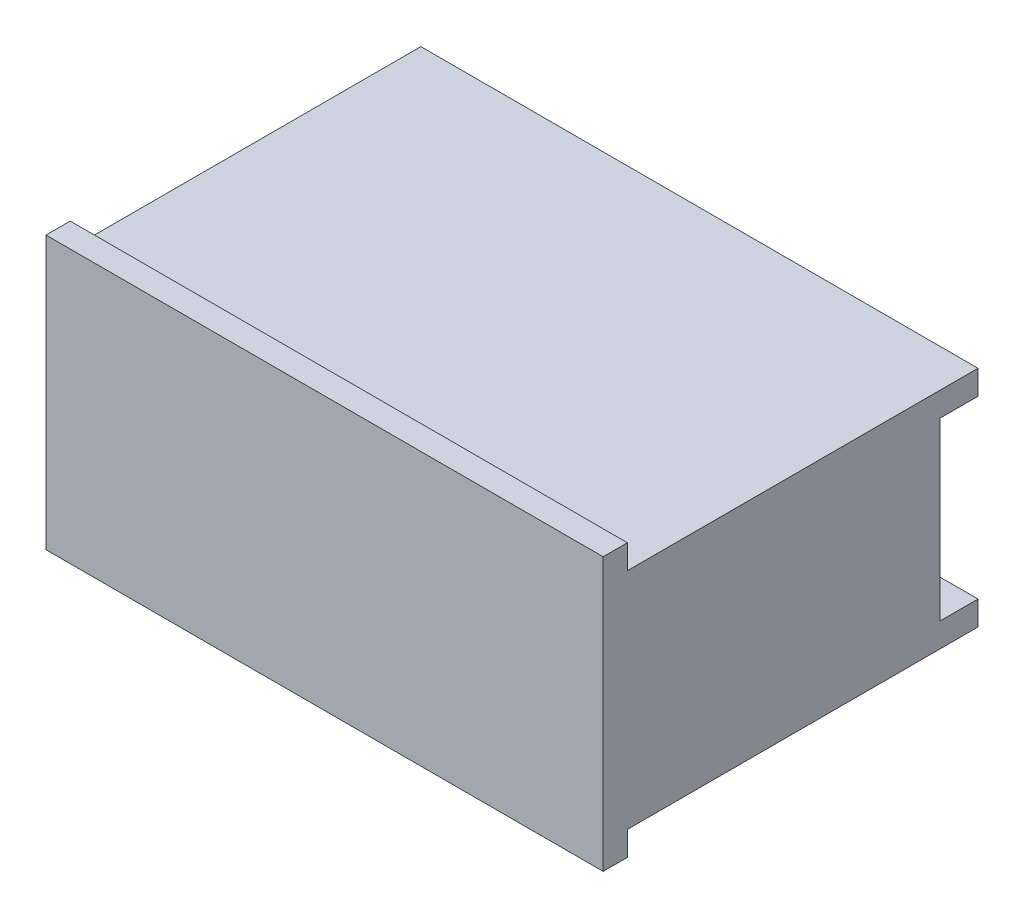
ISO-10303-21;
HEADER;
FILE_DESCRIPTION(('STEP AP214'),'2;1');
FILE_NAME('part.step','',(''),(''),'','','');
FILE_SCHEMA(('AUTOMOTIVE_DESIGN { 1 0 10303 214 1 1 1 1 }'));
ENDSEC;
DATA;
#1=APPLICATION_CONTEXT('core data for automotive mechanical design processes');
#2=APPLICATION_PROTOCOL_DEFINITION('international standard','automotive_design',2000,#1);
#3=PRODUCT_CONTEXT('',#1,'mechanical');
#4=PRODUCT('Part','Part','',(#3));
#5=PRODUCT_RELATED_PRODUCT_CATEGORY('part','',(#4));
#6=PRODUCT_DEFINITION_FORMATION('','',#4);
#7=PRODUCT_DEFINITION_CONTEXT('part definition',#1,'design');
#8=PRODUCT_DEFINITION('design','',#6,#7);
#9=PRODUCT_DEFINITION_SHAPE('','',#8);
#10=(LENGTH_UNIT() NAMED_UNIT(*) SI_UNIT(.MILLI.,.METRE.));
#11=(NAMED_UNIT(*) PLANE_ANGLE_UNIT() SI_UNIT($,.RADIAN.));
#12=(NAMED_UNIT(*) SI_UNIT($,.STERADIAN.) SOLID_ANGLE_UNIT());
#13=UNCERTAINTY_MEASURE_WITH_UNIT(LENGTH_MEASURE(1.E-05),#10,'distance_accuracy_value','');
#14=(GEOMETRIC_REPRESENTATION_CONTEXT(3) GLOBAL_UNCERTAINTY_ASSIGNED_CONTEXT((#13)) GLOBAL_UNIT_ASSIGNED_CONTEXT((#10,
#11,#12)) REPRESENTATION_CONTEXT('',''));
#15=CARTESIAN_POINT('',(0.,0.,0.));
#16=DIRECTION('',(0.,0.,1.));
#17=DIRECTION('',(1.,0.,0.));
#18=AXIS2_PLACEMENT_3D('',#15,#16,#17);
#19=CARTESIAN_POINT('',(0.,0.,-30.95));
#20=DIRECTION('',(0.,0.,1.));
#21=DIRECTION('',(1.,0.,0.));
#22=AXIS2_PLACEMENT_3D('',#19,#20,#21);
#23=PLANE('',#22);
#24=DIRECTION('',(1.,0.,0.));
#25=VECTOR('',#24,1.);
#26=CARTESIAN_POINT('',(23.,7.25,-30.95));
#27=LINE('',#26,#25);
#28=CARTESIAN_POINT('',(-23.,7.25,-30.95));
#29=VERTEX_POINT('',#28);
#30=CARTESIAN_POINT('',(23.,7.25,-30.95));
#31=VERTEX_POINT('',#30);
#32=EDGE_CURVE('E175',#29,#31,#27,.T.);
#33=ORIENTED_EDGE('',*,*,#32,.F.);
#34=DIRECTION('',(0.,-1.,0.));
#35=VECTOR('',#34,1.);
#36=CARTESIAN_POINT('',(-23.,9.25,-30.95));
#37=LINE('',#36,#35);
#38=CARTESIAN_POINT('',(-23.,9.25,-30.95));
#39=VERTEX_POINT('',#38);
#40=EDGE_CURVE('E206',#39,#29,#37,.T.);
#41=ORIENTED_EDGE('',*,*,#40,.F.);
#42=DIRECTION('',(-1.,0.,0.));
#43=VECTOR('',#42,1.);
#44=CARTESIAN_POINT('',(-23.,9.25,-30.95));
#45=LINE('',#44,#43);
#46=CARTESIAN_POINT('',(23.,9.25,-30.95));
#47=VERTEX_POINT('',#46);
#48=EDGE_CURVE('E203',#47,#39,#45,.T.);
#49=ORIENTED_EDGE('',*,*,#48,.F.);
#50=DIRECTION('',(0.,1.,0.));
#51=VECTOR('',#50,1.);
#52=CARTESIAN_POINT('',(23.,9.25,-30.95));
#53=LINE('',#52,#51);
#54=EDGE_CURVE('E205',#31,#47,#53,.T.);
#55=ORIENTED_EDGE('',*,*,#54,.F.);
#56=EDGE_LOOP('',(#33,#41,#49,#55));
#57=FACE_BOUND('',#56,.T.);
#58=ADVANCED_FACE('F39',(#57),#23,.F.);
#59=DIRECTION('',(-1.,0.,0.));
#60=VECTOR('',#59,1.);
#61=CARTESIAN_POINT('',(23.,-7.25,-30.95));
#62=LINE('',#61,#60);
#63=CARTESIAN_POINT('',(23.,-7.25,-30.95));
#64=VERTEX_POINT('',#63);
#65=CARTESIAN_POINT('',(-23.,-7.25,-30.95));
#66=VERTEX_POINT('',#65);
#67=EDGE_CURVE('E179',#64,#66,#62,.T.);
#68=ORIENTED_EDGE('',*,*,#67,.F.);
#69=CARTESIAN_POINT('',(23.,-9.25,-30.95));
#70=VERTEX_POINT('',#69);
#71=EDGE_CURVE('E196',#70,#64,#53,.T.);
#72=ORIENTED_EDGE('',*,*,#71,.F.);
#73=DIRECTION('',(1.,0.,0.));
#74=VECTOR('',#73,1.);
#75=CARTESIAN_POINT('',(-23.,-9.25,-30.95));
#76=LINE('',#75,#74);
#77=CARTESIAN_POINT('',(-23.,-9.25,-30.95));
#78=VERTEX_POINT('',#77);
#79=EDGE_CURVE('E207',#78,#70,#76,.T.);
#80=ORIENTED_EDGE('',*,*,#79,.F.);
#81=EDGE_CURVE('E202',#66,#78,#37,.T.);
#82=ORIENTED_EDGE('',*,*,#81,.F.);
#83=EDGE_LOOP('',(#68,#72,#80,#82));
#84=FACE_BOUND('',#83,.T.);
#85=ADVANCED_FACE('F241',(#84),#23,.F.);
#86=CARTESIAN_POINT('',(23.,9.25,-30.95));
#87=DIRECTION('',(1.,0.,0.));
#88=DIRECTION('',(0.,0.,-1.));
#89=AXIS2_PLACEMENT_3D('',#86,#87,#88);
#90=PLANE('',#89);
#91=DIRECTION('',(0.,-1.,0.));
#92=VECTOR('',#91,1.);
#93=CARTESIAN_POINT('',(23.,7.25,-27.8));
#94=LINE('',#93,#92);
#95=CARTESIAN_POINT('',(23.,7.25,-27.8));
#96=VERTEX_POINT('',#95);
#97=CARTESIAN_POINT('',(23.,-7.25,-27.8));
#98=VERTEX_POINT('',#97);
#99=EDGE_CURVE('E182',#96,#98,#94,.T.);
#100=ORIENTED_EDGE('',*,*,#99,.F.);
#101=DIRECTION('',(0.,0.,-1.));
#102=VECTOR('',#101,1.);
#103=CARTESIAN_POINT('',(23.,7.25,-27.8));
#104=LINE('',#103,#102);
#105=EDGE_CURVE('E193',#96,#31,#104,.T.);
#106=ORIENTED_EDGE('',*,*,#105,.T.);
#107=ORIENTED_EDGE('',*,*,#54,.T.);
#108=DIRECTION('',(0.,0.,1.));
#109=VECTOR('',#108,1.);
#110=CARTESIAN_POINT('',(23.,9.25,-30.95));
#111=LINE('',#110,#109);
#112=CARTESIAN_POINT('',(23.,9.25,-2.));
#113=VERTEX_POINT('',#112);
#114=EDGE_CURVE('E43',#47,#113,#111,.T.);
#115=ORIENTED_EDGE('',*,*,#114,.T.);
#116=DIRECTION('',(0.,-1.,0.));
#117=VECTOR('',#116,1.);
#118=CARTESIAN_POINT('',(23.,11.25,-2.));
#119=LINE('',#118,#117);
#120=CARTESIAN_POINT('',(23.,11.25,-2.));
#121=VERTEX_POINT('',#120);
#122=EDGE_CURVE('E132',#121,#113,#119,.T.);
#123=ORIENTED_EDGE('',*,*,#122,.F.);
#124=DIRECTION('',(0.,0.,-1.));
#125=VECTOR('',#124,1.);
#126=CARTESIAN_POINT('',(23.,11.25,-2.));
#127=LINE('',#126,#125);
#128=CARTESIAN_POINT('',(23.,11.25,0.));
#129=VERTEX_POINT('',#128);
#130=EDGE_CURVE('E142',#129,#121,#127,.T.);
#131=ORIENTED_EDGE('',*,*,#130,.F.);
#132=DIRECTION('',(0.,1.,0.));
#133=VECTOR('',#132,1.);
#134=CARTESIAN_POINT('',(23.,9.25,0.));
#135=LINE('',#134,#133);
#136=CARTESIAN_POINT('',(23.,-11.25,0.));
#137=VERTEX_POINT('',#136);
#138=EDGE_CURVE('E191',#137,#129,#135,.T.);
#139=ORIENTED_EDGE('',*,*,#138,.F.);
#140=DIRECTION('',(0.,0.,1.));
#141=VECTOR('',#140,1.);
#142=CARTESIAN_POINT('',(23.,-11.25,0.));
#143=LINE('',#142,#141);
#144=CARTESIAN_POINT('',(23.,-11.25,-2.));
#145=VERTEX_POINT('',#144);
#146=EDGE_CURVE('E153',#145,#137,#143,.T.);
#147=ORIENTED_EDGE('',*,*,#146,.F.);
#148=DIRECTION('',(0.,1.,0.));
#149=VECTOR('',#148,1.);
#150=CARTESIAN_POINT('',(23.,-11.25,-2.));
#151=LINE('',#150,#149);
#152=CARTESIAN_POINT('',(23.,-9.25,-2.));
#153=VERTEX_POINT('',#152);
#154=EDGE_CURVE('E167',#145,#153,#151,.T.);
#155=ORIENTED_EDGE('',*,*,#154,.T.);
#156=DIRECTION('',(0.,0.,1.));
#157=VECTOR('',#156,1.);
#158=CARTESIAN_POINT('',(23.,-9.25,-30.95));
#159=LINE('',#158,#157);
#160=EDGE_CURVE('E11',#70,#153,#159,.T.);
#161=ORIENTED_EDGE('',*,*,#160,.F.);
#162=ORIENTED_EDGE('',*,*,#71,.T.);
#163=DIRECTION('',(0.,0.,-1.));
#164=VECTOR('',#163,1.);
#165=CARTESIAN_POINT('',(23.,-7.25,-27.8));
#166=LINE('',#165,#164);
#167=EDGE_CURVE('E192',#98,#64,#166,.T.);
#168=ORIENTED_EDGE('',*,*,#167,.F.);
#169=EDGE_LOOP('',(#100,#106,#107,#115,#123,#131,#139,#147,#155,#161,#162,#168));
#170=FACE_BOUND('',#169,.T.);
#171=ADVANCED_FACE('F41',(#170),#90,.T.);
#172=CARTESIAN_POINT('',(-23.,9.25,-30.95));
#173=DIRECTION('',(-1.,0.,0.));
#174=DIRECTION('',(0.,0.,1.));
#175=AXIS2_PLACEMENT_3D('',#172,#173,#174);
#176=PLANE('',#175);
#177=DIRECTION('',(0.,1.,0.));
#178=VECTOR('',#177,1.);
#179=CARTESIAN_POINT('',(-23.,7.25,-27.8));
#180=LINE('',#179,#178);
#181=CARTESIAN_POINT('',(-23.,-7.25,-27.8));
#182=VERTEX_POINT('',#181);
#183=CARTESIAN_POINT('',(-23.,7.25,-27.8));
#184=VERTEX_POINT('',#183);
#185=EDGE_CURVE('E173',#182,#184,#180,.T.);
#186=ORIENTED_EDGE('',*,*,#185,.F.);
#187=DIRECTION('',(0.,0.,-1.));
#188=VECTOR('',#187,1.);
#189=CARTESIAN_POINT('',(-23.,-7.25,-27.8));
#190=LINE('',#189,#188);
#191=EDGE_CURVE('E190',#182,#66,#190,.T.);
#192=ORIENTED_EDGE('',*,*,#191,.T.);
#193=ORIENTED_EDGE('',*,*,#81,.T.);
#194=DIRECTION('',(0.,0.,1.));
#195=VECTOR('',#194,1.);
#196=CARTESIAN_POINT('',(-23.,-9.25,-30.95));
#197=LINE('',#196,#195);
#198=CARTESIAN_POINT('',(-23.,-9.25,-2.));
#199=VERTEX_POINT('',#198);
#200=EDGE_CURVE('E48',#78,#199,#197,.T.);
#201=ORIENTED_EDGE('',*,*,#200,.T.);
#202=DIRECTION('',(0.,1.,0.));
#203=VECTOR('',#202,1.);
#204=CARTESIAN_POINT('',(-23.,-11.25,-2.));
#205=LINE('',#204,#203);
#206=CARTESIAN_POINT('',(-23.,-11.25,-2.));
#207=VERTEX_POINT('',#206);
#208=EDGE_CURVE('E168',#207,#199,#205,.T.);
#209=ORIENTED_EDGE('',*,*,#208,.F.);
#210=DIRECTION('',(0.,0.,-1.));
#211=VECTOR('',#210,1.);
#212=CARTESIAN_POINT('',(-23.,-11.25,0.));
#213=LINE('',#212,#211);
#214=CARTESIAN_POINT('',(-23.,-11.25,0.));
#215=VERTEX_POINT('',#214);
#216=EDGE_CURVE('E162',#215,#207,#213,.T.);
#217=ORIENTED_EDGE('',*,*,#216,.F.);
#218=DIRECTION('',(0.,-1.,0.));
#219=VECTOR('',#218,1.);
#220=CARTESIAN_POINT('',(-23.,9.25,0.));
#221=LINE('',#220,#219);
#222=CARTESIAN_POINT('',(-23.,11.25,0.));
#223=VERTEX_POINT('',#222);
#224=EDGE_CURVE('E213',#223,#215,#221,.T.);
#225=ORIENTED_EDGE('',*,*,#224,.F.);
#226=DIRECTION('',(0.,0.,1.));
#227=VECTOR('',#226,1.);
#228=CARTESIAN_POINT('',(-23.,11.25,-2.));
#229=LINE('',#228,#227);
#230=CARTESIAN_POINT('',(-23.,11.25,-2.));
#231=VERTEX_POINT('',#230);
#232=EDGE_CURVE('E143',#231,#223,#229,.T.);
#233=ORIENTED_EDGE('',*,*,#232,.F.);
#234=DIRECTION('',(0.,-1.,0.));
#235=VECTOR('',#234,1.);
#236=CARTESIAN_POINT('',(-23.,11.25,-2.));
#237=LINE('',#236,#235);
#238=CARTESIAN_POINT('',(-23.,9.25,-2.));
#239=VERTEX_POINT('',#238);
#240=EDGE_CURVE('E137',#231,#239,#237,.T.);
#241=ORIENTED_EDGE('',*,*,#240,.T.);
#242=DIRECTION('',(0.,0.,1.));
#243=VECTOR('',#242,1.);
#244=CARTESIAN_POINT('',(-23.,9.25,-30.95));
#245=LINE('',#244,#243);
#246=EDGE_CURVE('E214',#39,#239,#245,.T.);
#247=ORIENTED_EDGE('',*,*,#246,.F.);
#248=ORIENTED_EDGE('',*,*,#40,.T.);
#249=DIRECTION('',(0.,0.,-1.));
#250=VECTOR('',#249,1.);
#251=CARTESIAN_POINT('',(-23.,7.25,-27.8));
#252=LINE('',#251,#250);
#253=EDGE_CURVE('E183',#184,#29,#252,.T.);
#254=ORIENTED_EDGE('',*,*,#253,.F.);
#255=EDGE_LOOP('',(#186,#192,#193,#201,#209,#217,#225,#233,#241,#247,#248,#254));
#256=FACE_BOUND('',#255,.T.);
#257=ADVANCED_FACE('F222',(#256),#176,.T.);
#258=CARTESIAN_POINT('',(-23.,-9.25,-30.95));
#259=DIRECTION('',(0.,-1.,0.));
#260=DIRECTION('',(0.,0.,-1.));
#261=AXIS2_PLACEMENT_3D('',#258,#259,#260);
#262=PLANE('',#261);
#263=DIRECTION('',(1.,0.,0.));
#264=VECTOR('',#263,1.);
#265=CARTESIAN_POINT('',(-23.,-9.25,-2.));
#266=LINE('',#265,#264);
#267=EDGE_CURVE('E65',#199,#153,#266,.T.);
#268=ORIENTED_EDGE('',*,*,#267,.F.);
#269=ORIENTED_EDGE('',*,*,#200,.F.);
#270=ORIENTED_EDGE('',*,*,#79,.T.);
#271=ORIENTED_EDGE('',*,*,#160,.T.);
#272=EDGE_LOOP('',(#268,#269,#270,#271));
#273=FACE_BOUND('',#272,.T.);
#274=ADVANCED_FACE('F236',(#273),#262,.T.);
#275=CARTESIAN_POINT('',(-23.,9.25,-30.95));
#276=DIRECTION('',(0.,1.,0.));
#277=DIRECTION('',(0.,0.,1.));
#278=AXIS2_PLACEMENT_3D('',#275,#276,#277);
#279=PLANE('',#278);
#280=DIRECTION('',(-1.,0.,0.));
#281=VECTOR('',#280,1.);
#282=CARTESIAN_POINT('',(-23.,9.25,-2.));
#283=LINE('',#282,#281);
#284=EDGE_CURVE('E57',#113,#239,#283,.T.);
#285=ORIENTED_EDGE('',*,*,#284,.F.);
#286=ORIENTED_EDGE('',*,*,#114,.F.);
#287=ORIENTED_EDGE('',*,*,#48,.T.);
#288=ORIENTED_EDGE('',*,*,#246,.T.);
#289=EDGE_LOOP('',(#285,#286,#287,#288));
#290=FACE_BOUND('',#289,.T.);
#291=ADVANCED_FACE('F216',(#290),#279,.T.);
#292=CARTESIAN_POINT('',(0.,0.,0.));
#293=DIRECTION('',(0.,0.,1.));
#294=DIRECTION('',(1.,0.,0.));
#295=AXIS2_PLACEMENT_3D('',#292,#293,#294);
#296=PLANE('',#295);
#297=ORIENTED_EDGE('',*,*,#138,.T.);
#298=DIRECTION('',(1.,0.,0.));
#299=VECTOR('',#298,1.);
#300=CARTESIAN_POINT('',(-23.,11.25,0.));
#301=LINE('',#300,#299);
#302=EDGE_CURVE('E146',#223,#129,#301,.T.);
#303=ORIENTED_EDGE('',*,*,#302,.F.);
#304=ORIENTED_EDGE('',*,*,#224,.T.);
#305=DIRECTION('',(-1.,0.,0.));
#306=VECTOR('',#305,1.);
#307=CARTESIAN_POINT('',(-23.,-11.25,0.));
#308=LINE('',#307,#306);
#309=EDGE_CURVE('E159',#137,#215,#308,.T.);
#310=ORIENTED_EDGE('',*,*,#309,.F.);
#311=EDGE_LOOP('',(#297,#303,#304,#310));
#312=FACE_BOUND('',#311,.T.);
#313=ADVANCED_FACE('F229',(#312),#296,.T.);
#314=CARTESIAN_POINT('',(23.,-7.25,-27.8));
#315=DIRECTION('',(0.,-1.,0.));
#316=DIRECTION('',(0.,0.,-1.));
#317=AXIS2_PLACEMENT_3D('',#314,#315,#316);
#318=PLANE('',#317);
#319=ORIENTED_EDGE('',*,*,#67,.T.);
#320=ORIENTED_EDGE('',*,*,#191,.F.);
#321=DIRECTION('',(-1.,0.,0.));
#322=VECTOR('',#321,1.);
#323=CARTESIAN_POINT('',(23.,-7.25,-27.8));
#324=LINE('',#323,#322);
#325=EDGE_CURVE('E181',#98,#182,#324,.T.);
#326=ORIENTED_EDGE('',*,*,#325,.F.);
#327=ORIENTED_EDGE('',*,*,#167,.T.);
#328=EDGE_LOOP('',(#319,#320,#326,#327));
#329=FACE_BOUND('',#328,.T.);
#330=ADVANCED_FACE('F246',(#329),#318,.F.);
#331=CARTESIAN_POINT('',(23.,7.25,-27.8));
#332=DIRECTION('',(0.,1.,0.));
#333=DIRECTION('',(0.,0.,1.));
#334=AXIS2_PLACEMENT_3D('',#331,#332,#333);
#335=PLANE('',#334);
#336=ORIENTED_EDGE('',*,*,#32,.T.);
#337=ORIENTED_EDGE('',*,*,#105,.F.);
#338=DIRECTION('',(1.,0.,0.));
#339=VECTOR('',#338,1.);
#340=CARTESIAN_POINT('',(23.,7.25,-27.8));
#341=LINE('',#340,#339);
#342=EDGE_CURVE('E177',#184,#96,#341,.T.);
#343=ORIENTED_EDGE('',*,*,#342,.F.);
#344=ORIENTED_EDGE('',*,*,#253,.T.);
#345=EDGE_LOOP('',(#336,#337,#343,#344));
#346=FACE_BOUND('',#345,.T.);
#347=ADVANCED_FACE('F252',(#346),#335,.F.);
#348=CARTESIAN_POINT('',(0.,0.,-27.8));
#349=DIRECTION('',(0.,0.,-1.));
#350=DIRECTION('',(-1.,0.,0.));
#351=AXIS2_PLACEMENT_3D('',#348,#349,#350);
#352=PLANE('',#351);
#353=ORIENTED_EDGE('',*,*,#185,.T.);
#354=ORIENTED_EDGE('',*,*,#342,.T.);
#355=ORIENTED_EDGE('',*,*,#99,.T.);
#356=ORIENTED_EDGE('',*,*,#325,.T.);
#357=EDGE_LOOP('',(#353,#354,#355,#356));
#358=FACE_BOUND('',#357,.T.);
#359=ADVANCED_FACE('F248',(#358),#352,.T.);
#360=CARTESIAN_POINT('',(-23.,-11.25,-2.));
#361=DIRECTION('',(0.,0.,1.));
#362=DIRECTION('',(1.,0.,0.));
#363=AXIS2_PLACEMENT_3D('',#360,#361,#362);
#364=PLANE('',#363);
#365=ORIENTED_EDGE('',*,*,#267,.T.);
#366=ORIENTED_EDGE('',*,*,#154,.F.);
#367=DIRECTION('',(1.,0.,0.));
#368=VECTOR('',#367,1.);
#369=CARTESIAN_POINT('',(-23.,-11.25,-2.));
#370=LINE('',#369,#368);
#371=EDGE_CURVE('E164',#207,#145,#370,.T.);
#372=ORIENTED_EDGE('',*,*,#371,.F.);
#373=ORIENTED_EDGE('',*,*,#208,.T.);
#374=EDGE_LOOP('',(#365,#366,#372,#373));
#375=FACE_BOUND('',#374,.T.);
#376=ADVANCED_FACE('F235',(#375),#364,.F.);
#377=CARTESIAN_POINT('',(0.,-11.25,0.));
#378=DIRECTION('',(0.,-1.,0.));
#379=DIRECTION('',(0.,0.,-1.));
#380=AXIS2_PLACEMENT_3D('',#377,#378,#379);
#381=PLANE('',#380);
#382=ORIENTED_EDGE('',*,*,#146,.T.);
#383=ORIENTED_EDGE('',*,*,#309,.T.);
#384=ORIENTED_EDGE('',*,*,#216,.T.);
#385=ORIENTED_EDGE('',*,*,#371,.T.);
#386=EDGE_LOOP('',(#382,#383,#384,#385));
#387=FACE_BOUND('',#386,.T.);
#388=ADVANCED_FACE('F231',(#387),#381,.T.);
#389=CARTESIAN_POINT('',(-23.,11.25,-2.));
#390=DIRECTION('',(0.,0.,1.));
#391=DIRECTION('',(1.,0.,0.));
#392=AXIS2_PLACEMENT_3D('',#389,#390,#391);
#393=PLANE('',#392);
#394=ORIENTED_EDGE('',*,*,#284,.T.);
#395=ORIENTED_EDGE('',*,*,#240,.F.);
#396=DIRECTION('',(-1.,0.,0.));
#397=VECTOR('',#396,1.);
#398=CARTESIAN_POINT('',(-23.,11.25,-2.));
#399=LINE('',#398,#397);
#400=EDGE_CURVE('E134',#121,#231,#399,.T.);
#401=ORIENTED_EDGE('',*,*,#400,.F.);
#402=ORIENTED_EDGE('',*,*,#122,.T.);
#403=EDGE_LOOP('',(#394,#395,#401,#402));
#404=FACE_BOUND('',#403,.T.);
#405=ADVANCED_FACE('F135',(#404),#393,.F.);
#406=CARTESIAN_POINT('',(0.,11.25,0.));
#407=DIRECTION('',(0.,1.,0.));
#408=DIRECTION('',(0.,0.,1.));
#409=AXIS2_PLACEMENT_3D('',#406,#407,#408);
#410=PLANE('',#409);
#411=ORIENTED_EDGE('',*,*,#130,.T.);
#412=ORIENTED_EDGE('',*,*,#400,.T.);
#413=ORIENTED_EDGE('',*,*,#232,.T.);
#414=ORIENTED_EDGE('',*,*,#302,.T.);
#415=EDGE_LOOP('',(#411,#412,#413,#414));
#416=FACE_BOUND('',#415,.T.);
#417=ADVANCED_FACE('F148',(#416),#410,.T.);
#418=CLOSED_SHELL('',(#58,#85,#171,#257,#274,#291,#313,#330,#347,#359,#376,#388,#405,#417));
#419=MANIFOLD_SOLID_BREP('B2',#418);
#420=ADVANCED_BREP_SHAPE_REPRESENTATION('',(#18,#419),#14);
#421=SHAPE_DEFINITION_REPRESENTATION(#9,#420);
ENDSEC;
END-ISO-10303-21;
